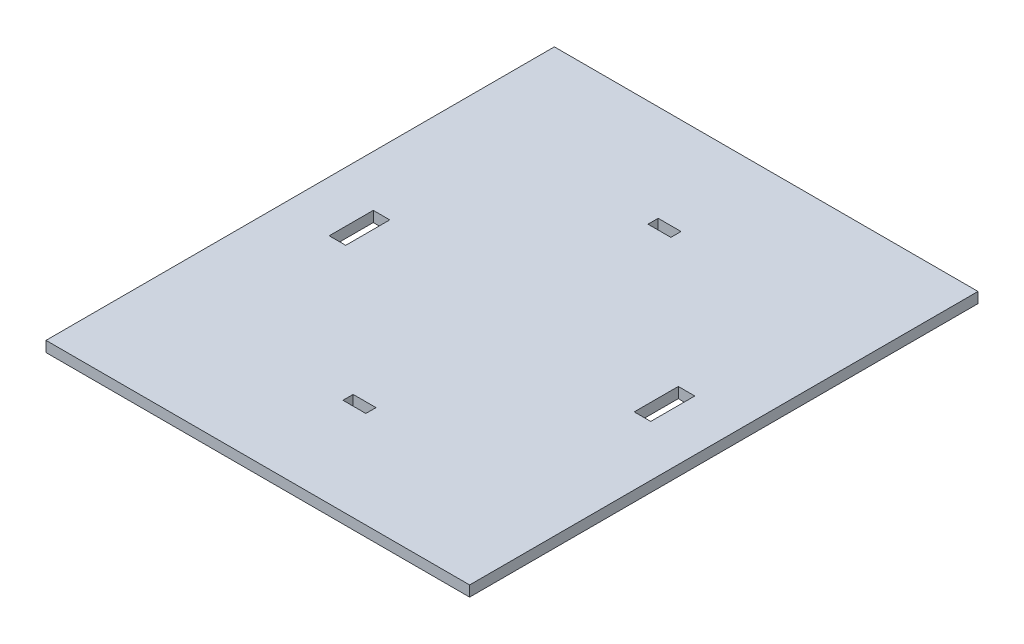
ISO-10303-21;
HEADER;
FILE_DESCRIPTION(('STEP AP214'),'2;1');
FILE_NAME('part.step','',(''),(''),'','','');
FILE_SCHEMA(('AUTOMOTIVE_DESIGN { 1 0 10303 214 1 1 1 1 }'));
ENDSEC;
DATA;
#1=APPLICATION_CONTEXT('core data for automotive mechanical design processes');
#2=APPLICATION_PROTOCOL_DEFINITION('international standard','automotive_design',2000,#1);
#3=PRODUCT_CONTEXT('',#1,'mechanical');
#4=PRODUCT('Part','Part','',(#3));
#5=PRODUCT_RELATED_PRODUCT_CATEGORY('part','',(#4));
#6=PRODUCT_DEFINITION_FORMATION('','',#4);
#7=PRODUCT_DEFINITION_CONTEXT('part definition',#1,'design');
#8=PRODUCT_DEFINITION('design','',#6,#7);
#9=PRODUCT_DEFINITION_SHAPE('','',#8);
#10=(LENGTH_UNIT() NAMED_UNIT(*) SI_UNIT(.MILLI.,.METRE.));
#11=(NAMED_UNIT(*) PLANE_ANGLE_UNIT() SI_UNIT($,.RADIAN.));
#12=(NAMED_UNIT(*) SI_UNIT($,.STERADIAN.) SOLID_ANGLE_UNIT());
#13=UNCERTAINTY_MEASURE_WITH_UNIT(LENGTH_MEASURE(1.E-05),#10,'distance_accuracy_value','');
#14=(GEOMETRIC_REPRESENTATION_CONTEXT(3) GLOBAL_UNCERTAINTY_ASSIGNED_CONTEXT((#13)) GLOBAL_UNIT_ASSIGNED_CONTEXT((#10,
#11,#12)) REPRESENTATION_CONTEXT('',''));
#15=CARTESIAN_POINT('',(0.,0.,0.));
#16=DIRECTION('',(0.,0.,1.));
#17=DIRECTION('',(1.,0.,0.));
#18=AXIS2_PLACEMENT_3D('',#15,#16,#17);
#19=CARTESIAN_POINT('',(0.,-2.5,0.));
#20=DIRECTION('',(0.,-1.,0.));
#21=DIRECTION('',(0.,0.,-1.));
#22=AXIS2_PLACEMENT_3D('',#19,#20,#21);
#23=PLANE('',#22);
#24=DIRECTION('',(-1.,0.,0.));
#25=VECTOR('',#24,1.);
#26=CARTESIAN_POINT('',(2.7,-2.5,-37.2));
#27=LINE('',#26,#25);
#28=CARTESIAN_POINT('',(2.7,-2.5,-37.2));
#29=VERTEX_POINT('',#28);
#30=CARTESIAN_POINT('',(-2.7,-2.5,-37.2));
#31=VERTEX_POINT('',#30);
#32=EDGE_CURVE('E244',#29,#31,#27,.T.);
#33=ORIENTED_EDGE('',*,*,#32,.T.);
#34=DIRECTION('',(0.,0.,1.));
#35=VECTOR('',#34,1.);
#36=CARTESIAN_POINT('',(-2.7,-2.5,-37.2));
#37=LINE('',#36,#35);
#38=CARTESIAN_POINT('',(-2.7,-2.5,-34.8));
#39=VERTEX_POINT('',#38);
#40=EDGE_CURVE('E247',#31,#39,#37,.T.);
#41=ORIENTED_EDGE('',*,*,#40,.T.);
#42=DIRECTION('',(1.,0.,0.));
#43=VECTOR('',#42,1.);
#44=CARTESIAN_POINT('',(-2.7,-2.5,-34.8));
#45=LINE('',#44,#43);
#46=CARTESIAN_POINT('',(2.7,-2.5,-34.8));
#47=VERTEX_POINT('',#46);
#48=EDGE_CURVE('E251',#39,#47,#45,.T.);
#49=ORIENTED_EDGE('',*,*,#48,.T.);
#50=DIRECTION('',(0.,0.,-1.));
#51=VECTOR('',#50,1.);
#52=CARTESIAN_POINT('',(2.7,-2.5,-34.8));
#53=LINE('',#52,#51);
#54=EDGE_CURVE('E254',#47,#29,#53,.T.);
#55=ORIENTED_EDGE('',*,*,#54,.T.);
#56=EDGE_LOOP('',(#33,#41,#49,#55));
#57=FACE_BOUND('',#56,.T.);
#58=DIRECTION('',(1.,0.,0.));
#59=VECTOR('',#58,1.);
#60=CARTESIAN_POINT('',(-37.95,-2.5,5.20000000000001));
#61=LINE('',#60,#59);
#62=CARTESIAN_POINT('',(-37.95,-2.5,5.20000000000001));
#63=VERTEX_POINT('',#62);
#64=CARTESIAN_POINT('',(-34.05,-2.5,5.20000000000001));
#65=VERTEX_POINT('',#64);
#66=EDGE_CURVE('E291',#63,#65,#61,.T.);
#67=ORIENTED_EDGE('',*,*,#66,.T.);
#68=DIRECTION('',(0.,0.,-1.));
#69=VECTOR('',#68,1.);
#70=CARTESIAN_POINT('',(-34.05,-2.5,5.20000000000001));
#71=LINE('',#70,#69);
#72=CARTESIAN_POINT('',(-34.05,-2.5,-5.19999999999999));
#73=VERTEX_POINT('',#72);
#74=EDGE_CURVE('E303',#65,#73,#71,.T.);
#75=ORIENTED_EDGE('',*,*,#74,.T.);
#76=DIRECTION('',(-1.,0.,0.));
#77=VECTOR('',#76,1.);
#78=CARTESIAN_POINT('',(-34.05,-2.5,-5.19999999999999));
#79=LINE('',#78,#77);
#80=CARTESIAN_POINT('',(-37.95,-2.5,-5.19999999999999));
#81=VERTEX_POINT('',#80);
#82=EDGE_CURVE('E300',#73,#81,#79,.T.);
#83=ORIENTED_EDGE('',*,*,#82,.T.);
#84=DIRECTION('',(0.,0.,1.));
#85=VECTOR('',#84,1.);
#86=CARTESIAN_POINT('',(-37.95,-2.5,-5.19999999999999));
#87=LINE('',#86,#85);
#88=EDGE_CURVE('E281',#81,#63,#87,.T.);
#89=ORIENTED_EDGE('',*,*,#88,.T.);
#90=EDGE_LOOP('',(#67,#75,#83,#89));
#91=FACE_BOUND('',#90,.T.);
#92=DIRECTION('',(-1.,0.,0.));
#93=VECTOR('',#92,1.);
#94=CARTESIAN_POINT('',(-50.,-2.5,-60.));
#95=LINE('',#94,#93);
#96=CARTESIAN_POINT('',(50.,-2.5,-60.));
#97=VERTEX_POINT('',#96);
#98=CARTESIAN_POINT('',(-50.,-2.5,-60.));
#99=VERTEX_POINT('',#98);
#100=EDGE_CURVE('E308',#97,#99,#95,.T.);
#101=ORIENTED_EDGE('',*,*,#100,.F.);
#102=DIRECTION('',(0.,0.,-1.));
#103=VECTOR('',#102,1.);
#104=CARTESIAN_POINT('',(50.,-2.5,-60.));
#105=LINE('',#104,#103);
#106=CARTESIAN_POINT('',(50.,-2.5,60.));
#107=VERTEX_POINT('',#106);
#108=EDGE_CURVE('E318',#107,#97,#105,.T.);
#109=ORIENTED_EDGE('',*,*,#108,.F.);
#110=DIRECTION('',(1.,0.,0.));
#111=VECTOR('',#110,1.);
#112=CARTESIAN_POINT('',(50.,-2.5,60.));
#113=LINE('',#112,#111);
#114=CARTESIAN_POINT('',(-50.,-2.5,60.));
#115=VERTEX_POINT('',#114);
#116=EDGE_CURVE('E315',#115,#107,#113,.T.);
#117=ORIENTED_EDGE('',*,*,#116,.F.);
#118=DIRECTION('',(0.,0.,1.));
#119=VECTOR('',#118,1.);
#120=CARTESIAN_POINT('',(-50.,-2.5,60.));
#121=LINE('',#120,#119);
#122=EDGE_CURVE('E311',#99,#115,#121,.T.);
#123=ORIENTED_EDGE('',*,*,#122,.F.);
#124=EDGE_LOOP('',(#101,#109,#117,#123));
#125=FACE_BOUND('',#124,.T.);
#126=DIRECTION('',(0.,0.,-1.));
#127=VECTOR('',#126,1.);
#128=CARTESIAN_POINT('',(-2.7,-2.5,37.2));
#129=LINE('',#128,#127);
#130=CARTESIAN_POINT('',(-2.7,-2.5,37.2));
#131=VERTEX_POINT('',#130);
#132=CARTESIAN_POINT('',(-2.7,-2.5,34.8));
#133=VERTEX_POINT('',#132);
#134=EDGE_CURVE('E221',#131,#133,#129,.T.);
#135=ORIENTED_EDGE('',*,*,#134,.F.);
#136=DIRECTION('',(-1.,0.,0.));
#137=VECTOR('',#136,1.);
#138=CARTESIAN_POINT('',(2.7,-2.5,37.2));
#139=LINE('',#138,#137);
#140=CARTESIAN_POINT('',(2.7,-2.5,37.2));
#141=VERTEX_POINT('',#140);
#142=EDGE_CURVE('E213',#141,#131,#139,.T.);
#143=ORIENTED_EDGE('',*,*,#142,.F.);
#144=DIRECTION('',(0.,0.,1.));
#145=VECTOR('',#144,1.);
#146=CARTESIAN_POINT('',(2.7,-2.5,34.8));
#147=LINE('',#146,#145);
#148=CARTESIAN_POINT('',(2.7,-2.5,34.8));
#149=VERTEX_POINT('',#148);
#150=EDGE_CURVE('E215',#149,#141,#147,.T.);
#151=ORIENTED_EDGE('',*,*,#150,.F.);
#152=DIRECTION('',(1.,0.,0.));
#153=VECTOR('',#152,1.);
#154=CARTESIAN_POINT('',(-2.7,-2.5,34.8));
#155=LINE('',#154,#153);
#156=EDGE_CURVE('E218',#133,#149,#155,.T.);
#157=ORIENTED_EDGE('',*,*,#156,.F.);
#158=EDGE_LOOP('',(#135,#143,#151,#157));
#159=FACE_BOUND('',#158,.T.);
#160=DIRECTION('',(0.,0.,-1.));
#161=VECTOR('',#160,1.);
#162=CARTESIAN_POINT('',(34.05,-2.5,5.20000000000001));
#163=LINE('',#162,#161);
#164=CARTESIAN_POINT('',(34.05,-2.5,5.20000000000001));
#165=VERTEX_POINT('',#164);
#166=CARTESIAN_POINT('',(34.05,-2.5,-5.19999999999999));
#167=VERTEX_POINT('',#166);
#168=EDGE_CURVE('E191',#165,#167,#163,.T.);
#169=ORIENTED_EDGE('',*,*,#168,.F.);
#170=DIRECTION('',(-1.,0.,0.));
#171=VECTOR('',#170,1.);
#172=CARTESIAN_POINT('',(37.95,-2.5,5.20000000000001));
#173=LINE('',#172,#171);
#174=CARTESIAN_POINT('',(37.95,-2.5,5.20000000000001));
#175=VERTEX_POINT('',#174);
#176=EDGE_CURVE('E187',#175,#165,#173,.T.);
#177=ORIENTED_EDGE('',*,*,#176,.F.);
#178=DIRECTION('',(0.,0.,1.));
#179=VECTOR('',#178,1.);
#180=CARTESIAN_POINT('',(37.95,-2.5,-5.19999999999999));
#181=LINE('',#180,#179);
#182=CARTESIAN_POINT('',(37.95,-2.5,-5.19999999999999));
#183=VERTEX_POINT('',#182);
#184=EDGE_CURVE('E179',#183,#175,#181,.T.);
#185=ORIENTED_EDGE('',*,*,#184,.F.);
#186=DIRECTION('',(1.,0.,0.));
#187=VECTOR('',#186,1.);
#188=CARTESIAN_POINT('',(34.05,-2.5,-5.19999999999999));
#189=LINE('',#188,#187);
#190=EDGE_CURVE('E186',#167,#183,#189,.T.);
#191=ORIENTED_EDGE('',*,*,#190,.F.);
#192=EDGE_LOOP('',(#169,#177,#185,#191));
#193=FACE_BOUND('',#192,.T.);
#194=ADVANCED_FACE('F41',(#57,#91,#125,#159,#193),#23,.T.);
#195=CARTESIAN_POINT('',(0.,0.,0.));
#196=DIRECTION('',(0.,-1.,0.));
#197=DIRECTION('',(0.,0.,-1.));
#198=AXIS2_PLACEMENT_3D('',#195,#196,#197);
#199=PLANE('',#198);
#200=DIRECTION('',(-1.,0.,0.));
#201=VECTOR('',#200,1.);
#202=CARTESIAN_POINT('',(2.7,0.,37.2));
#203=LINE('',#202,#201);
#204=CARTESIAN_POINT('',(2.7,0.,37.2));
#205=VERTEX_POINT('',#204);
#206=CARTESIAN_POINT('',(-2.7,0.,37.2));
#207=VERTEX_POINT('',#206);
#208=EDGE_CURVE('E209',#205,#207,#203,.T.);
#209=ORIENTED_EDGE('',*,*,#208,.T.);
#210=DIRECTION('',(0.,0.,-1.));
#211=VECTOR('',#210,1.);
#212=CARTESIAN_POINT('',(-2.7,0.,37.2));
#213=LINE('',#212,#211);
#214=CARTESIAN_POINT('',(-2.7,0.,34.8));
#215=VERTEX_POINT('',#214);
#216=EDGE_CURVE('E216',#207,#215,#213,.T.);
#217=ORIENTED_EDGE('',*,*,#216,.T.);
#218=DIRECTION('',(1.,0.,0.));
#219=VECTOR('',#218,1.);
#220=CARTESIAN_POINT('',(-2.7,0.,34.8));
#221=LINE('',#220,#219);
#222=CARTESIAN_POINT('',(2.7,0.,34.8));
#223=VERTEX_POINT('',#222);
#224=EDGE_CURVE('E229',#215,#223,#221,.T.);
#225=ORIENTED_EDGE('',*,*,#224,.T.);
#226=DIRECTION('',(0.,0.,1.));
#227=VECTOR('',#226,1.);
#228=CARTESIAN_POINT('',(2.7,0.,34.8));
#229=LINE('',#228,#227);
#230=EDGE_CURVE('E226',#223,#205,#229,.T.);
#231=ORIENTED_EDGE('',*,*,#230,.T.);
#232=EDGE_LOOP('',(#209,#217,#225,#231));
#233=FACE_BOUND('',#232,.T.);
#234=DIRECTION('',(0.,0.,1.));
#235=VECTOR('',#234,1.);
#236=CARTESIAN_POINT('',(-2.7,0.,-37.2));
#237=LINE('',#236,#235);
#238=CARTESIAN_POINT('',(-2.7,0.,-37.2));
#239=VERTEX_POINT('',#238);
#240=CARTESIAN_POINT('',(-2.7,0.,-34.8));
#241=VERTEX_POINT('',#240);
#242=EDGE_CURVE('E260',#239,#241,#237,.T.);
#243=ORIENTED_EDGE('',*,*,#242,.F.);
#244=DIRECTION('',(-1.,0.,0.));
#245=VECTOR('',#244,1.);
#246=CARTESIAN_POINT('',(2.7,0.,-37.2));
#247=LINE('',#246,#245);
#248=CARTESIAN_POINT('',(2.7,0.,-37.2));
#249=VERTEX_POINT('',#248);
#250=EDGE_CURVE('E258',#249,#239,#247,.T.);
#251=ORIENTED_EDGE('',*,*,#250,.F.);
#252=DIRECTION('',(0.,0.,-1.));
#253=VECTOR('',#252,1.);
#254=CARTESIAN_POINT('',(2.7,0.,-34.8));
#255=LINE('',#254,#253);
#256=CARTESIAN_POINT('',(2.7,0.,-34.8));
#257=VERTEX_POINT('',#256);
#258=EDGE_CURVE('E248',#257,#249,#255,.T.);
#259=ORIENTED_EDGE('',*,*,#258,.F.);
#260=DIRECTION('',(1.,0.,0.));
#261=VECTOR('',#260,1.);
#262=CARTESIAN_POINT('',(-2.7,0.,-34.8));
#263=LINE('',#262,#261);
#264=EDGE_CURVE('E264',#241,#257,#263,.T.);
#265=ORIENTED_EDGE('',*,*,#264,.F.);
#266=EDGE_LOOP('',(#243,#251,#259,#265));
#267=FACE_BOUND('',#266,.T.);
#268=DIRECTION('',(0.,0.,-1.));
#269=VECTOR('',#268,1.);
#270=CARTESIAN_POINT('',(-34.05,0.,5.20000000000001));
#271=LINE('',#270,#269);
#272=CARTESIAN_POINT('',(-34.05,0.,5.20000000000001));
#273=VERTEX_POINT('',#272);
#274=CARTESIAN_POINT('',(-34.05,0.,-5.19999999999999));
#275=VERTEX_POINT('',#274);
#276=EDGE_CURVE('E294',#273,#275,#271,.T.);
#277=ORIENTED_EDGE('',*,*,#276,.F.);
#278=DIRECTION('',(1.,0.,0.));
#279=VECTOR('',#278,1.);
#280=CARTESIAN_POINT('',(-37.95,0.,5.20000000000001));
#281=LINE('',#280,#279);
#282=CARTESIAN_POINT('',(-37.95,0.,5.20000000000001));
#283=VERTEX_POINT('',#282);
#284=EDGE_CURVE('E261',#283,#273,#281,.T.);
#285=ORIENTED_EDGE('',*,*,#284,.F.);
#286=DIRECTION('',(0.,0.,1.));
#287=VECTOR('',#286,1.);
#288=CARTESIAN_POINT('',(-37.95,0.,-5.19999999999999));
#289=LINE('',#288,#287);
#290=CARTESIAN_POINT('',(-37.95,0.,-5.19999999999999));
#291=VERTEX_POINT('',#290);
#292=EDGE_CURVE('E287',#291,#283,#289,.T.);
#293=ORIENTED_EDGE('',*,*,#292,.F.);
#294=DIRECTION('',(-1.,0.,0.));
#295=VECTOR('',#294,1.);
#296=CARTESIAN_POINT('',(-34.05,0.,-5.19999999999999));
#297=LINE('',#296,#295);
#298=EDGE_CURVE('E290',#275,#291,#297,.T.);
#299=ORIENTED_EDGE('',*,*,#298,.F.);
#300=EDGE_LOOP('',(#277,#285,#293,#299));
#301=FACE_BOUND('',#300,.T.);
#302=DIRECTION('',(-1.,0.,0.));
#303=VECTOR('',#302,1.);
#304=CARTESIAN_POINT('',(-50.,0.,-60.));
#305=LINE('',#304,#303);
#306=CARTESIAN_POINT('',(50.,0.,-60.));
#307=VERTEX_POINT('',#306);
#308=CARTESIAN_POINT('',(-50.,0.,-60.));
#309=VERTEX_POINT('',#308);
#310=EDGE_CURVE('E271',#307,#309,#305,.T.);
#311=ORIENTED_EDGE('',*,*,#310,.T.);
#312=DIRECTION('',(0.,0.,1.));
#313=VECTOR('',#312,1.);
#314=CARTESIAN_POINT('',(-50.,0.,60.));
#315=LINE('',#314,#313);
#316=CARTESIAN_POINT('',(-50.,0.,60.));
#317=VERTEX_POINT('',#316);
#318=EDGE_CURVE('E323',#309,#317,#315,.T.);
#319=ORIENTED_EDGE('',*,*,#318,.T.);
#320=DIRECTION('',(1.,0.,0.));
#321=VECTOR('',#320,1.);
#322=CARTESIAN_POINT('',(50.,0.,60.));
#323=LINE('',#322,#321);
#324=CARTESIAN_POINT('',(50.,0.,60.));
#325=VERTEX_POINT('',#324);
#326=EDGE_CURVE('E326',#317,#325,#323,.T.);
#327=ORIENTED_EDGE('',*,*,#326,.T.);
#328=DIRECTION('',(0.,0.,-1.));
#329=VECTOR('',#328,1.);
#330=CARTESIAN_POINT('',(50.,0.,-60.));
#331=LINE('',#330,#329);
#332=EDGE_CURVE('E312',#325,#307,#331,.T.);
#333=ORIENTED_EDGE('',*,*,#332,.T.);
#334=EDGE_LOOP('',(#311,#319,#327,#333));
#335=FACE_BOUND('',#334,.T.);
#336=DIRECTION('',(-1.,0.,0.));
#337=VECTOR('',#336,1.);
#338=CARTESIAN_POINT('',(37.95,0.,5.20000000000001));
#339=LINE('',#338,#337);
#340=CARTESIAN_POINT('',(37.95,0.,5.20000000000001));
#341=VERTEX_POINT('',#340);
#342=CARTESIAN_POINT('',(34.05,0.,5.20000000000001));
#343=VERTEX_POINT('',#342);
#344=EDGE_CURVE('E66',#341,#343,#339,.T.);
#345=ORIENTED_EDGE('',*,*,#344,.T.);
#346=DIRECTION('',(0.,0.,-1.));
#347=VECTOR('',#346,1.);
#348=CARTESIAN_POINT('',(34.05,0.,5.20000000000001));
#349=LINE('',#348,#347);
#350=CARTESIAN_POINT('',(34.05,0.,-5.19999999999999));
#351=VERTEX_POINT('',#350);
#352=EDGE_CURVE('E194',#343,#351,#349,.T.);
#353=ORIENTED_EDGE('',*,*,#352,.T.);
#354=DIRECTION('',(1.,0.,0.));
#355=VECTOR('',#354,1.);
#356=CARTESIAN_POINT('',(34.05,0.,-5.19999999999999));
#357=LINE('',#356,#355);
#358=CARTESIAN_POINT('',(37.95,0.,-5.19999999999999));
#359=VERTEX_POINT('',#358);
#360=EDGE_CURVE('E197',#351,#359,#357,.T.);
#361=ORIENTED_EDGE('',*,*,#360,.T.);
#362=DIRECTION('',(0.,0.,1.));
#363=VECTOR('',#362,1.);
#364=CARTESIAN_POINT('',(37.95,0.,-5.19999999999999));
#365=LINE('',#364,#363);
#366=EDGE_CURVE('E203',#359,#341,#365,.T.);
#367=ORIENTED_EDGE('',*,*,#366,.T.);
#368=EDGE_LOOP('',(#345,#353,#361,#367));
#369=FACE_BOUND('',#368,.T.);
#370=ADVANCED_FACE('F341',(#233,#267,#301,#335,#369),#199,.F.);
#371=CARTESIAN_POINT('',(-50.,-2.5,-60.));
#372=DIRECTION('',(0.,0.,-1.));
#373=DIRECTION('',(-1.,0.,0.));
#374=AXIS2_PLACEMENT_3D('',#371,#372,#373);
#375=PLANE('',#374);
#376=ORIENTED_EDGE('',*,*,#310,.F.);
#377=DIRECTION('',(0.,1.,0.));
#378=VECTOR('',#377,1.);
#379=CARTESIAN_POINT('',(50.,-2.5,-60.));
#380=LINE('',#379,#378);
#381=EDGE_CURVE('E11',#97,#307,#380,.T.);
#382=ORIENTED_EDGE('',*,*,#381,.F.);
#383=ORIENTED_EDGE('',*,*,#100,.T.);
#384=DIRECTION('',(0.,1.,0.));
#385=VECTOR('',#384,1.);
#386=CARTESIAN_POINT('',(-50.,-2.5,-60.));
#387=LINE('',#386,#385);
#388=EDGE_CURVE('E45',#99,#309,#387,.T.);
#389=ORIENTED_EDGE('',*,*,#388,.T.);
#390=EDGE_LOOP('',(#376,#382,#383,#389));
#391=FACE_BOUND('',#390,.T.);
#392=ADVANCED_FACE('F43',(#391),#375,.T.);
#393=CARTESIAN_POINT('',(50.,-2.5,-60.));
#394=DIRECTION('',(1.,0.,0.));
#395=DIRECTION('',(0.,0.,-1.));
#396=AXIS2_PLACEMENT_3D('',#393,#394,#395);
#397=PLANE('',#396);
#398=ORIENTED_EDGE('',*,*,#332,.F.);
#399=DIRECTION('',(0.,1.,0.));
#400=VECTOR('',#399,1.);
#401=CARTESIAN_POINT('',(50.,-2.5,60.));
#402=LINE('',#401,#400);
#403=EDGE_CURVE('E50',#107,#325,#402,.T.);
#404=ORIENTED_EDGE('',*,*,#403,.F.);
#405=ORIENTED_EDGE('',*,*,#108,.T.);
#406=ORIENTED_EDGE('',*,*,#381,.T.);
#407=EDGE_LOOP('',(#398,#404,#405,#406));
#408=FACE_BOUND('',#407,.T.);
#409=ADVANCED_FACE('F345',(#408),#397,.T.);
#410=CARTESIAN_POINT('',(50.,-2.5,60.));
#411=DIRECTION('',(0.,0.,1.));
#412=DIRECTION('',(1.,0.,0.));
#413=AXIS2_PLACEMENT_3D('',#410,#411,#412);
#414=PLANE('',#413);
#415=ORIENTED_EDGE('',*,*,#326,.F.);
#416=DIRECTION('',(0.,1.,0.));
#417=VECTOR('',#416,1.);
#418=CARTESIAN_POINT('',(-50.,-2.5,60.));
#419=LINE('',#418,#417);
#420=EDGE_CURVE('E331',#115,#317,#419,.T.);
#421=ORIENTED_EDGE('',*,*,#420,.F.);
#422=ORIENTED_EDGE('',*,*,#116,.T.);
#423=ORIENTED_EDGE('',*,*,#403,.T.);
#424=EDGE_LOOP('',(#415,#421,#422,#423));
#425=FACE_BOUND('',#424,.T.);
#426=ADVANCED_FACE('F351',(#425),#414,.T.);
#427=CARTESIAN_POINT('',(-50.,-2.5,60.));
#428=DIRECTION('',(-1.,0.,0.));
#429=DIRECTION('',(0.,0.,1.));
#430=AXIS2_PLACEMENT_3D('',#427,#428,#429);
#431=PLANE('',#430);
#432=ORIENTED_EDGE('',*,*,#318,.F.);
#433=ORIENTED_EDGE('',*,*,#388,.F.);
#434=ORIENTED_EDGE('',*,*,#122,.T.);
#435=ORIENTED_EDGE('',*,*,#420,.T.);
#436=EDGE_LOOP('',(#432,#433,#434,#435));
#437=FACE_BOUND('',#436,.T.);
#438=ADVANCED_FACE('F339',(#437),#431,.T.);
#439=CARTESIAN_POINT('',(-37.95,-2.5,5.20000000000001));
#440=DIRECTION('',(0.,0.,1.));
#441=DIRECTION('',(1.,0.,0.));
#442=AXIS2_PLACEMENT_3D('',#439,#440,#441);
#443=PLANE('',#442);
#444=ORIENTED_EDGE('',*,*,#284,.T.);
#445=DIRECTION('',(0.,1.,0.));
#446=VECTOR('',#445,1.);
#447=CARTESIAN_POINT('',(-34.05,-2.5,5.20000000000001));
#448=LINE('',#447,#446);
#449=EDGE_CURVE('E278',#65,#273,#448,.T.);
#450=ORIENTED_EDGE('',*,*,#449,.F.);
#451=ORIENTED_EDGE('',*,*,#66,.F.);
#452=DIRECTION('',(0.,1.,0.));
#453=VECTOR('',#452,1.);
#454=CARTESIAN_POINT('',(-37.95,-2.5,5.20000000000001));
#455=LINE('',#454,#453);
#456=EDGE_CURVE('E237',#63,#283,#455,.T.);
#457=ORIENTED_EDGE('',*,*,#456,.T.);
#458=EDGE_LOOP('',(#444,#450,#451,#457));
#459=FACE_BOUND('',#458,.T.);
#460=ADVANCED_FACE('F358',(#459),#443,.F.);
#461=CARTESIAN_POINT('',(-37.95,-2.5,-5.19999999999999));
#462=DIRECTION('',(-1.,0.,0.));
#463=DIRECTION('',(0.,0.,1.));
#464=AXIS2_PLACEMENT_3D('',#461,#462,#463);
#465=PLANE('',#464);
#466=ORIENTED_EDGE('',*,*,#292,.T.);
#467=ORIENTED_EDGE('',*,*,#456,.F.);
#468=ORIENTED_EDGE('',*,*,#88,.F.);
#469=DIRECTION('',(0.,1.,0.));
#470=VECTOR('',#469,1.);
#471=CARTESIAN_POINT('',(-37.95,-2.5,-5.19999999999999));
#472=LINE('',#471,#470);
#473=EDGE_CURVE('E284',#81,#291,#472,.T.);
#474=ORIENTED_EDGE('',*,*,#473,.T.);
#475=EDGE_LOOP('',(#466,#467,#468,#474));
#476=FACE_BOUND('',#475,.T.);
#477=ADVANCED_FACE('F371',(#476),#465,.F.);
#478=CARTESIAN_POINT('',(-34.05,-2.5,-5.19999999999999));
#479=DIRECTION('',(0.,0.,-1.));
#480=DIRECTION('',(-1.,0.,0.));
#481=AXIS2_PLACEMENT_3D('',#478,#479,#480);
#482=PLANE('',#481);
#483=ORIENTED_EDGE('',*,*,#298,.T.);
#484=ORIENTED_EDGE('',*,*,#473,.F.);
#485=ORIENTED_EDGE('',*,*,#82,.F.);
#486=DIRECTION('',(0.,1.,0.));
#487=VECTOR('',#486,1.);
#488=CARTESIAN_POINT('',(-34.05,-2.5,-5.19999999999999));
#489=LINE('',#488,#487);
#490=EDGE_CURVE('E282',#73,#275,#489,.T.);
#491=ORIENTED_EDGE('',*,*,#490,.T.);
#492=EDGE_LOOP('',(#483,#484,#485,#491));
#493=FACE_BOUND('',#492,.T.);
#494=ADVANCED_FACE('F374',(#493),#482,.F.);
#495=CARTESIAN_POINT('',(-34.05,-2.5,5.20000000000001));
#496=DIRECTION('',(1.,0.,0.));
#497=DIRECTION('',(0.,0.,-1.));
#498=AXIS2_PLACEMENT_3D('',#495,#496,#497);
#499=PLANE('',#498);
#500=ORIENTED_EDGE('',*,*,#276,.T.);
#501=ORIENTED_EDGE('',*,*,#490,.F.);
#502=ORIENTED_EDGE('',*,*,#74,.F.);
#503=ORIENTED_EDGE('',*,*,#449,.T.);
#504=EDGE_LOOP('',(#500,#501,#502,#503));
#505=FACE_BOUND('',#504,.T.);
#506=ADVANCED_FACE('F378',(#505),#499,.F.);
#507=CARTESIAN_POINT('',(2.7,-2.5,-37.2));
#508=DIRECTION('',(0.,0.,-1.));
#509=DIRECTION('',(-1.,0.,0.));
#510=AXIS2_PLACEMENT_3D('',#507,#508,#509);
#511=PLANE('',#510);
#512=ORIENTED_EDGE('',*,*,#250,.T.);
#513=DIRECTION('',(0.,1.,0.));
#514=VECTOR('',#513,1.);
#515=CARTESIAN_POINT('',(-2.7,-2.5,-37.2));
#516=LINE('',#515,#514);
#517=EDGE_CURVE('E257',#31,#239,#516,.T.);
#518=ORIENTED_EDGE('',*,*,#517,.F.);
#519=ORIENTED_EDGE('',*,*,#32,.F.);
#520=DIRECTION('',(0.,1.,0.));
#521=VECTOR('',#520,1.);
#522=CARTESIAN_POINT('',(2.7,-2.5,-37.2));
#523=LINE('',#522,#521);
#524=EDGE_CURVE('E269',#29,#249,#523,.T.);
#525=ORIENTED_EDGE('',*,*,#524,.T.);
#526=EDGE_LOOP('',(#512,#518,#519,#525));
#527=FACE_BOUND('',#526,.T.);
#528=ADVANCED_FACE('F382',(#527),#511,.F.);
#529=CARTESIAN_POINT('',(2.7,-2.5,-34.8));
#530=DIRECTION('',(1.,0.,0.));
#531=DIRECTION('',(0.,0.,-1.));
#532=AXIS2_PLACEMENT_3D('',#529,#530,#531);
#533=PLANE('',#532);
#534=ORIENTED_EDGE('',*,*,#258,.T.);
#535=ORIENTED_EDGE('',*,*,#524,.F.);
#536=ORIENTED_EDGE('',*,*,#54,.F.);
#537=DIRECTION('',(0.,1.,0.));
#538=VECTOR('',#537,1.);
#539=CARTESIAN_POINT('',(2.7,-2.5,-34.8));
#540=LINE('',#539,#538);
#541=EDGE_CURVE('E272',#47,#257,#540,.T.);
#542=ORIENTED_EDGE('',*,*,#541,.T.);
#543=EDGE_LOOP('',(#534,#535,#536,#542));
#544=FACE_BOUND('',#543,.T.);
#545=ADVANCED_FACE('F389',(#544),#533,.F.);
#546=CARTESIAN_POINT('',(-2.7,-2.5,-34.8));
#547=DIRECTION('',(0.,0.,1.));
#548=DIRECTION('',(1.,0.,0.));
#549=AXIS2_PLACEMENT_3D('',#546,#547,#548);
#550=PLANE('',#549);
#551=ORIENTED_EDGE('',*,*,#264,.T.);
#552=ORIENTED_EDGE('',*,*,#541,.F.);
#553=ORIENTED_EDGE('',*,*,#48,.F.);
#554=DIRECTION('',(0.,1.,0.));
#555=VECTOR('',#554,1.);
#556=CARTESIAN_POINT('',(-2.7,-2.5,-34.8));
#557=LINE('',#556,#555);
#558=EDGE_CURVE('E274',#39,#241,#557,.T.);
#559=ORIENTED_EDGE('',*,*,#558,.T.);
#560=EDGE_LOOP('',(#551,#552,#553,#559));
#561=FACE_BOUND('',#560,.T.);
#562=ADVANCED_FACE('F394',(#561),#550,.F.);
#563=CARTESIAN_POINT('',(-2.7,-2.5,-37.2));
#564=DIRECTION('',(-1.,0.,0.));
#565=DIRECTION('',(0.,0.,1.));
#566=AXIS2_PLACEMENT_3D('',#563,#564,#565);
#567=PLANE('',#566);
#568=ORIENTED_EDGE('',*,*,#242,.T.);
#569=ORIENTED_EDGE('',*,*,#558,.F.);
#570=ORIENTED_EDGE('',*,*,#40,.F.);
#571=ORIENTED_EDGE('',*,*,#517,.T.);
#572=EDGE_LOOP('',(#568,#569,#570,#571));
#573=FACE_BOUND('',#572,.T.);
#574=ADVANCED_FACE('F391',(#573),#567,.F.);
#575=CARTESIAN_POINT('',(2.7,-2.5,37.2));
#576=DIRECTION('',(0.,0.,-1.));
#577=DIRECTION('',(-1.,0.,0.));
#578=AXIS2_PLACEMENT_3D('',#575,#576,#577);
#579=PLANE('',#578);
#580=ORIENTED_EDGE('',*,*,#208,.F.);
#581=DIRECTION('',(0.,1.,0.));
#582=VECTOR('',#581,1.);
#583=CARTESIAN_POINT('',(2.7,-2.5,37.2));
#584=LINE('',#583,#582);
#585=EDGE_CURVE('E223',#141,#205,#584,.T.);
#586=ORIENTED_EDGE('',*,*,#585,.F.);
#587=ORIENTED_EDGE('',*,*,#142,.T.);
#588=DIRECTION('',(0.,1.,0.));
#589=VECTOR('',#588,1.);
#590=CARTESIAN_POINT('',(-2.7,-2.5,37.2));
#591=LINE('',#590,#589);
#592=EDGE_CURVE('E234',#131,#207,#591,.T.);
#593=ORIENTED_EDGE('',*,*,#592,.T.);
#594=EDGE_LOOP('',(#580,#586,#587,#593));
#595=FACE_BOUND('',#594,.T.);
#596=ADVANCED_FACE('F393',(#595),#579,.T.);
#597=CARTESIAN_POINT('',(-2.7,-2.5,37.2));
#598=DIRECTION('',(1.,0.,0.));
#599=DIRECTION('',(0.,0.,-1.));
#600=AXIS2_PLACEMENT_3D('',#597,#598,#599);
#601=PLANE('',#600);
#602=ORIENTED_EDGE('',*,*,#216,.F.);
#603=ORIENTED_EDGE('',*,*,#592,.F.);
#604=ORIENTED_EDGE('',*,*,#134,.T.);
#605=DIRECTION('',(0.,1.,0.));
#606=VECTOR('',#605,1.);
#607=CARTESIAN_POINT('',(-2.7,-2.5,34.8));
#608=LINE('',#607,#606);
#609=EDGE_CURVE('E238',#133,#215,#608,.T.);
#610=ORIENTED_EDGE('',*,*,#609,.T.);
#611=EDGE_LOOP('',(#602,#603,#604,#610));
#612=FACE_BOUND('',#611,.T.);
#613=ADVANCED_FACE('F404',(#612),#601,.T.);
#614=CARTESIAN_POINT('',(-2.7,-2.5,34.8));
#615=DIRECTION('',(0.,0.,1.));
#616=DIRECTION('',(1.,0.,0.));
#617=AXIS2_PLACEMENT_3D('',#614,#615,#616);
#618=PLANE('',#617);
#619=ORIENTED_EDGE('',*,*,#224,.F.);
#620=ORIENTED_EDGE('',*,*,#609,.F.);
#621=ORIENTED_EDGE('',*,*,#156,.T.);
#622=DIRECTION('',(0.,1.,0.));
#623=VECTOR('',#622,1.);
#624=CARTESIAN_POINT('',(2.7,-2.5,34.8));
#625=LINE('',#624,#623);
#626=EDGE_CURVE('E240',#149,#223,#625,.T.);
#627=ORIENTED_EDGE('',*,*,#626,.T.);
#628=EDGE_LOOP('',(#619,#620,#621,#627));
#629=FACE_BOUND('',#628,.T.);
#630=ADVANCED_FACE('F409',(#629),#618,.T.);
#631=CARTESIAN_POINT('',(2.7,-2.5,34.8));
#632=DIRECTION('',(-1.,0.,0.));
#633=DIRECTION('',(0.,0.,1.));
#634=AXIS2_PLACEMENT_3D('',#631,#632,#633);
#635=PLANE('',#634);
#636=ORIENTED_EDGE('',*,*,#230,.F.);
#637=ORIENTED_EDGE('',*,*,#626,.F.);
#638=ORIENTED_EDGE('',*,*,#150,.T.);
#639=ORIENTED_EDGE('',*,*,#585,.T.);
#640=EDGE_LOOP('',(#636,#637,#638,#639));
#641=FACE_BOUND('',#640,.T.);
#642=ADVANCED_FACE('F406',(#641),#635,.T.);
#643=CARTESIAN_POINT('',(37.95,-2.5,5.20000000000001));
#644=DIRECTION('',(0.,0.,-1.));
#645=DIRECTION('',(-1.,0.,0.));
#646=AXIS2_PLACEMENT_3D('',#643,#644,#645);
#647=PLANE('',#646);
#648=ORIENTED_EDGE('',*,*,#344,.F.);
#649=DIRECTION('',(0.,1.,0.));
#650=VECTOR('',#649,1.);
#651=CARTESIAN_POINT('',(37.95,-2.5,5.20000000000001));
#652=LINE('',#651,#650);
#653=EDGE_CURVE('E181',#175,#341,#652,.T.);
#654=ORIENTED_EDGE('',*,*,#653,.F.);
#655=ORIENTED_EDGE('',*,*,#176,.T.);
#656=DIRECTION('',(0.,1.,0.));
#657=VECTOR('',#656,1.);
#658=CARTESIAN_POINT('',(34.05,-2.5,5.20000000000001));
#659=LINE('',#658,#657);
#660=EDGE_CURVE('E207',#165,#343,#659,.T.);
#661=ORIENTED_EDGE('',*,*,#660,.T.);
#662=EDGE_LOOP('',(#648,#654,#655,#661));
#663=FACE_BOUND('',#662,.T.);
#664=ADVANCED_FACE('F189',(#663),#647,.T.);
#665=CARTESIAN_POINT('',(34.05,-2.5,5.20000000000001));
#666=DIRECTION('',(1.,0.,0.));
#667=DIRECTION('',(0.,0.,-1.));
#668=AXIS2_PLACEMENT_3D('',#665,#666,#667);
#669=PLANE('',#668);
#670=ORIENTED_EDGE('',*,*,#352,.F.);
#671=ORIENTED_EDGE('',*,*,#660,.F.);
#672=ORIENTED_EDGE('',*,*,#168,.T.);
#673=DIRECTION('',(0.,1.,0.));
#674=VECTOR('',#673,1.);
#675=CARTESIAN_POINT('',(34.05,-2.5,-5.19999999999999));
#676=LINE('',#675,#674);
#677=EDGE_CURVE('E210',#167,#351,#676,.T.);
#678=ORIENTED_EDGE('',*,*,#677,.T.);
#679=EDGE_LOOP('',(#670,#671,#672,#678));
#680=FACE_BOUND('',#679,.T.);
#681=ADVANCED_FACE('F419',(#680),#669,.T.);
#682=CARTESIAN_POINT('',(34.05,-2.5,-5.19999999999999));
#683=DIRECTION('',(0.,0.,1.));
#684=DIRECTION('',(1.,0.,0.));
#685=AXIS2_PLACEMENT_3D('',#682,#683,#684);
#686=PLANE('',#685);
#687=ORIENTED_EDGE('',*,*,#360,.F.);
#688=ORIENTED_EDGE('',*,*,#677,.F.);
#689=ORIENTED_EDGE('',*,*,#190,.T.);
#690=DIRECTION('',(0.,1.,0.));
#691=VECTOR('',#690,1.);
#692=CARTESIAN_POINT('',(37.95,-2.5,-5.19999999999999));
#693=LINE('',#692,#691);
#694=EDGE_CURVE('E58',#183,#359,#693,.T.);
#695=ORIENTED_EDGE('',*,*,#694,.T.);
#696=EDGE_LOOP('',(#687,#688,#689,#695));
#697=FACE_BOUND('',#696,.T.);
#698=ADVANCED_FACE('F422',(#697),#686,.T.);
#699=CARTESIAN_POINT('',(37.95,-2.5,-5.19999999999999));
#700=DIRECTION('',(-1.,0.,0.));
#701=DIRECTION('',(0.,0.,1.));
#702=AXIS2_PLACEMENT_3D('',#699,#700,#701);
#703=PLANE('',#702);
#704=ORIENTED_EDGE('',*,*,#366,.F.);
#705=ORIENTED_EDGE('',*,*,#694,.F.);
#706=ORIENTED_EDGE('',*,*,#184,.T.);
#707=ORIENTED_EDGE('',*,*,#653,.T.);
#708=EDGE_LOOP('',(#704,#705,#706,#707));
#709=FACE_BOUND('',#708,.T.);
#710=ADVANCED_FACE('F180',(#709),#703,.T.);
#711=CLOSED_SHELL('',(#194,#370,#392,#409,#426,#438,#460,#477,#494,#506,#528,#545,#562,#574,
#596,#613,#630,#642,#664,#681,#698,#710));
#712=MANIFOLD_SOLID_BREP('B2',#711);
#713=ADVANCED_BREP_SHAPE_REPRESENTATION('',(#18,#712),#14);
#714=SHAPE_DEFINITION_REPRESENTATION(#9,#713);
ENDSEC;
END-ISO-10303-21;
